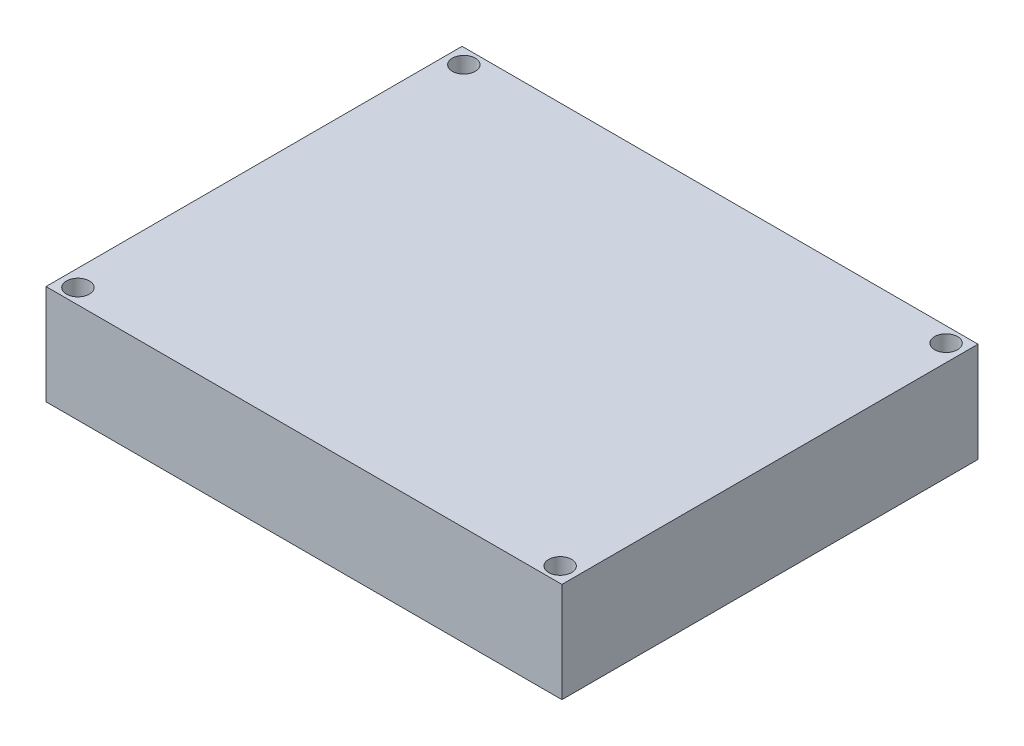
ISO-10303-21;
HEADER;
FILE_DESCRIPTION(('STEP AP214'),'2;1');
FILE_NAME('part.step','',(''),(''),'','','');
FILE_SCHEMA(('AUTOMOTIVE_DESIGN { 1 0 10303 214 1 1 1 1 }'));
ENDSEC;
DATA;
#1=APPLICATION_CONTEXT('core data for automotive mechanical design processes');
#2=APPLICATION_PROTOCOL_DEFINITION('international standard','automotive_design',2000,#1);
#3=PRODUCT_CONTEXT('',#1,'mechanical');
#4=PRODUCT('Part','Part','',(#3));
#5=PRODUCT_RELATED_PRODUCT_CATEGORY('part','',(#4));
#6=PRODUCT_DEFINITION_FORMATION('','',#4);
#7=PRODUCT_DEFINITION_CONTEXT('part definition',#1,'design');
#8=PRODUCT_DEFINITION('design','',#6,#7);
#9=PRODUCT_DEFINITION_SHAPE('','',#8);
#10=(LENGTH_UNIT() NAMED_UNIT(*) SI_UNIT(.MILLI.,.METRE.));
#11=(NAMED_UNIT(*) PLANE_ANGLE_UNIT() SI_UNIT($,.RADIAN.));
#12=(NAMED_UNIT(*) SI_UNIT($,.STERADIAN.) SOLID_ANGLE_UNIT());
#13=UNCERTAINTY_MEASURE_WITH_UNIT(LENGTH_MEASURE(1.E-05),#10,'distance_accuracy_value','');
#14=(GEOMETRIC_REPRESENTATION_CONTEXT(3) GLOBAL_UNCERTAINTY_ASSIGNED_CONTEXT((#13)) GLOBAL_UNIT_ASSIGNED_CONTEXT((#10,
#11,#12)) REPRESENTATION_CONTEXT('',''));
#15=CARTESIAN_POINT('',(0.,0.,0.));
#16=DIRECTION('',(0.,0.,1.));
#17=DIRECTION('',(1.,0.,0.));
#18=AXIS2_PLACEMENT_3D('',#15,#16,#17);
#19=CARTESIAN_POINT('',(0.,329.841390192382,0.));
#20=DIRECTION('',(0.,1.,0.));
#21=DIRECTION('',(0.,0.,1.));
#22=AXIS2_PLACEMENT_3D('',#19,#20,#21);
#23=PLANE('',#22);
#24=DIRECTION('',(0.,0.,1.));
#25=VECTOR('',#24,1.);
#26=CARTESIAN_POINT('',(-13.9910723176011,329.841390192382,-23.5500705078854));
#27=LINE('',#26,#25);
#28=CARTESIAN_POINT('',(-13.9910723176011,329.841390192382,-87.0500705078854));
#29=VERTEX_POINT('',#28);
#30=CARTESIAN_POINT('',(-13.9910723176011,329.841390192382,-23.5500705078854));
#31=VERTEX_POINT('',#30);
#32=EDGE_CURVE('E83',#29,#31,#27,.T.);
#33=ORIENTED_EDGE('',*,*,#32,.T.);
#34=DIRECTION('',(-1.,0.,0.));
#35=VECTOR('',#34,1.);
#36=CARTESIAN_POINT('',(-13.9910723176011,329.841390192382,-23.5500705078854));
#37=LINE('',#36,#35);
#38=CARTESIAN_POINT('',(-92.731072317601,329.841390192382,-23.5500705078854));
#39=VERTEX_POINT('',#38);
#40=EDGE_CURVE('E78',#31,#39,#37,.T.);
#41=ORIENTED_EDGE('',*,*,#40,.T.);
#42=DIRECTION('',(0.,0.,-1.));
#43=VECTOR('',#42,1.);
#44=CARTESIAN_POINT('',(-92.731072317601,329.841390192382,-23.5500705078854));
#45=LINE('',#44,#43);
#46=CARTESIAN_POINT('',(-92.7310723176011,329.841390192382,-87.0500705078854));
#47=VERTEX_POINT('',#46);
#48=EDGE_CURVE('E81',#39,#47,#45,.T.);
#49=ORIENTED_EDGE('',*,*,#48,.T.);
#50=DIRECTION('',(1.,0.,0.));
#51=VECTOR('',#50,1.);
#52=CARTESIAN_POINT('',(-13.9910723176011,329.841390192382,-87.0500705078854));
#53=LINE('',#52,#51);
#54=EDGE_CURVE('E48',#47,#29,#53,.T.);
#55=ORIENTED_EDGE('',*,*,#54,.T.);
#56=EDGE_LOOP('',(#33,#41,#49,#55));
#57=FACE_BOUND('',#56,.T.);
#58=CARTESIAN_POINT('',(-16.5610723176011,329.841390192382,-25.8500705078854));
#59=DIRECTION('',(0.,-1.,0.));
#60=DIRECTION('',(0.,0.,-1.));
#61=AXIS2_PLACEMENT_3D('',#58,#59,#60);
#62=CIRCLE('',#61,1.75000000000001);
#63=CARTESIAN_POINT('',(-16.5610723176011,329.841390192382,-24.1000705078854));
#64=VERTEX_POINT('',#63);
#65=EDGE_CURVE('E98',#64,#64,#62,.T.);
#66=ORIENTED_EDGE('',*,*,#65,.F.);
#67=EDGE_LOOP('',(#66));
#68=FACE_BOUND('',#67,.T.);
#69=CARTESIAN_POINT('',(-90.1610723176011,329.841390192382,-84.7500705078854));
#70=DIRECTION('',(0.,-1.,0.));
#71=DIRECTION('',(0.,0.,-1.));
#72=AXIS2_PLACEMENT_3D('',#69,#70,#71);
#73=CIRCLE('',#72,1.75000000000001);
#74=CARTESIAN_POINT('',(-90.1610723176011,329.841390192382,-83.0000705078854));
#75=VERTEX_POINT('',#74);
#76=EDGE_CURVE('E113',#75,#75,#73,.T.);
#77=ORIENTED_EDGE('',*,*,#76,.F.);
#78=EDGE_LOOP('',(#77));
#79=FACE_BOUND('',#78,.T.);
#80=CARTESIAN_POINT('',(-90.1610723176011,329.841390192382,-25.8500705078854));
#81=DIRECTION('',(0.,-1.,0.));
#82=DIRECTION('',(0.,0.,-1.));
#83=AXIS2_PLACEMENT_3D('',#80,#81,#82);
#84=CIRCLE('',#83,1.75000000000001);
#85=CARTESIAN_POINT('',(-90.1610723176011,329.841390192382,-24.1000705078854));
#86=VERTEX_POINT('',#85);
#87=EDGE_CURVE('E119',#86,#86,#84,.T.);
#88=ORIENTED_EDGE('',*,*,#87,.F.);
#89=EDGE_LOOP('',(#88));
#90=FACE_BOUND('',#89,.T.);
#91=CARTESIAN_POINT('',(-16.5610723176011,329.841390192382,-84.7500705078854));
#92=DIRECTION('',(0.,-1.,0.));
#93=DIRECTION('',(0.,0.,-1.));
#94=AXIS2_PLACEMENT_3D('',#91,#92,#93);
#95=CIRCLE('',#94,1.75000000000001);
#96=CARTESIAN_POINT('',(-16.5610723176011,329.841390192382,-83.0000705078854));
#97=VERTEX_POINT('',#96);
#98=EDGE_CURVE('E125',#97,#97,#95,.T.);
#99=ORIENTED_EDGE('',*,*,#98,.F.);
#100=EDGE_LOOP('',(#99));
#101=FACE_BOUND('',#100,.T.);
#102=ADVANCED_FACE('F31',(#57,#68,#79,#90,#101),#23,.F.);
#103=CARTESIAN_POINT('',(0.,345.081390192382,0.));
#104=DIRECTION('',(0.,1.,0.));
#105=DIRECTION('',(0.,0.,1.));
#106=AXIS2_PLACEMENT_3D('',#103,#104,#105);
#107=PLANE('',#106);
#108=CARTESIAN_POINT('',(-90.1610723176011,345.081390192382,-25.8500705078854));
#109=DIRECTION('',(0.,-1.,0.));
#110=DIRECTION('',(0.,0.,-1.));
#111=AXIS2_PLACEMENT_3D('',#108,#109,#110);
#112=CIRCLE('',#111,1.75000000000001);
#113=CARTESIAN_POINT('',(-90.1610723176011,345.081390192382,-24.1000705078854));
#114=VERTEX_POINT('',#113);
#115=EDGE_CURVE('E122',#114,#114,#112,.T.);
#116=ORIENTED_EDGE('',*,*,#115,.T.);
#117=EDGE_LOOP('',(#116));
#118=FACE_BOUND('',#117,.T.);
#119=CARTESIAN_POINT('',(-16.5610723176011,345.081390192382,-25.8500705078854));
#120=DIRECTION('',(0.,-1.,0.));
#121=DIRECTION('',(0.,0.,-1.));
#122=AXIS2_PLACEMENT_3D('',#119,#120,#121);
#123=CIRCLE('',#122,1.75000000000001);
#124=CARTESIAN_POINT('',(-16.5610723176011,345.081390192382,-24.1000705078854));
#125=VERTEX_POINT('',#124);
#126=EDGE_CURVE('E110',#125,#125,#123,.T.);
#127=ORIENTED_EDGE('',*,*,#126,.T.);
#128=EDGE_LOOP('',(#127));
#129=FACE_BOUND('',#128,.T.);
#130=DIRECTION('',(0.,0.,1.));
#131=VECTOR('',#130,1.);
#132=CARTESIAN_POINT('',(-13.9910723176011,345.081390192382,-23.5500705078854));
#133=LINE('',#132,#131);
#134=CARTESIAN_POINT('',(-13.9910723176011,345.081390192382,-87.0500705078854));
#135=VERTEX_POINT('',#134);
#136=CARTESIAN_POINT('',(-13.9910723176011,345.081390192382,-23.5500705078854));
#137=VERTEX_POINT('',#136);
#138=EDGE_CURVE('E95',#135,#137,#133,.T.);
#139=ORIENTED_EDGE('',*,*,#138,.F.);
#140=DIRECTION('',(1.,0.,0.));
#141=VECTOR('',#140,1.);
#142=CARTESIAN_POINT('',(-13.9910723176011,345.081390192382,-87.0500705078854));
#143=LINE('',#142,#141);
#144=CARTESIAN_POINT('',(-92.7310723176011,345.081390192382,-87.0500705078854));
#145=VERTEX_POINT('',#144);
#146=EDGE_CURVE('E71',#145,#135,#143,.T.);
#147=ORIENTED_EDGE('',*,*,#146,.F.);
#148=DIRECTION('',(0.,0.,-1.));
#149=VECTOR('',#148,1.);
#150=CARTESIAN_POINT('',(-92.731072317601,345.081390192382,-23.5500705078854));
#151=LINE('',#150,#149);
#152=CARTESIAN_POINT('',(-92.731072317601,345.081390192382,-23.5500705078854));
#153=VERTEX_POINT('',#152);
#154=EDGE_CURVE('E65',#153,#145,#151,.T.);
#155=ORIENTED_EDGE('',*,*,#154,.F.);
#156=DIRECTION('',(-1.,0.,0.));
#157=VECTOR('',#156,1.);
#158=CARTESIAN_POINT('',(-13.9910723176011,345.081390192382,-23.5500705078854));
#159=LINE('',#158,#157);
#160=EDGE_CURVE('E87',#137,#153,#159,.T.);
#161=ORIENTED_EDGE('',*,*,#160,.F.);
#162=EDGE_LOOP('',(#139,#147,#155,#161));
#163=FACE_BOUND('',#162,.T.);
#164=CARTESIAN_POINT('',(-90.1610723176011,345.081390192382,-84.7500705078854));
#165=DIRECTION('',(0.,-1.,0.));
#166=DIRECTION('',(0.,0.,-1.));
#167=AXIS2_PLACEMENT_3D('',#164,#165,#166);
#168=CIRCLE('',#167,1.75000000000001);
#169=CARTESIAN_POINT('',(-90.1610723176011,345.081390192382,-83.0000705078854));
#170=VERTEX_POINT('',#169);
#171=EDGE_CURVE('E116',#170,#170,#168,.T.);
#172=ORIENTED_EDGE('',*,*,#171,.T.);
#173=EDGE_LOOP('',(#172));
#174=FACE_BOUND('',#173,.T.);
#175=CARTESIAN_POINT('',(-16.5610723176011,345.081390192382,-84.7500705078854));
#176=DIRECTION('',(0.,-1.,0.));
#177=DIRECTION('',(0.,0.,-1.));
#178=AXIS2_PLACEMENT_3D('',#175,#176,#177);
#179=CIRCLE('',#178,1.75000000000001);
#180=CARTESIAN_POINT('',(-16.5610723176011,345.081390192382,-83.0000705078854));
#181=VERTEX_POINT('',#180);
#182=EDGE_CURVE('E128',#181,#181,#179,.T.);
#183=ORIENTED_EDGE('',*,*,#182,.T.);
#184=EDGE_LOOP('',(#183));
#185=FACE_BOUND('',#184,.T.);
#186=ADVANCED_FACE('F106',(#118,#129,#163,#174,#185),#107,.T.);
#187=CARTESIAN_POINT('',(-13.9910723176011,329.841390192382,-23.5500705078854));
#188=DIRECTION('',(-1.,0.,0.));
#189=DIRECTION('',(0.,0.,1.));
#190=AXIS2_PLACEMENT_3D('',#187,#188,#189);
#191=PLANE('',#190);
#192=ORIENTED_EDGE('',*,*,#138,.T.);
#193=DIRECTION('',(0.,1.,0.));
#194=VECTOR('',#193,1.);
#195=CARTESIAN_POINT('',(-13.9910723176011,329.841390192382,-23.5500705078854));
#196=LINE('',#195,#194);
#197=EDGE_CURVE('E11',#31,#137,#196,.T.);
#198=ORIENTED_EDGE('',*,*,#197,.F.);
#199=ORIENTED_EDGE('',*,*,#32,.F.);
#200=DIRECTION('',(0.,1.,0.));
#201=VECTOR('',#200,1.);
#202=CARTESIAN_POINT('',(-13.9910723176011,329.841390192382,-87.0500705078854));
#203=LINE('',#202,#201);
#204=EDGE_CURVE('E91',#29,#135,#203,.T.);
#205=ORIENTED_EDGE('',*,*,#204,.T.);
#206=EDGE_LOOP('',(#192,#198,#199,#205));
#207=FACE_BOUND('',#206,.T.);
#208=ADVANCED_FACE('F33',(#207),#191,.F.);
#209=CARTESIAN_POINT('',(-13.9910723176011,329.841390192382,-23.5500705078854));
#210=DIRECTION('',(0.,0.,-1.));
#211=DIRECTION('',(-1.,0.,0.));
#212=AXIS2_PLACEMENT_3D('',#209,#210,#211);
#213=PLANE('',#212);
#214=ORIENTED_EDGE('',*,*,#160,.T.);
#215=DIRECTION('',(0.,1.,0.));
#216=VECTOR('',#215,1.);
#217=CARTESIAN_POINT('',(-92.731072317601,329.841390192382,-23.5500705078854));
#218=LINE('',#217,#216);
#219=EDGE_CURVE('E40',#39,#153,#218,.T.);
#220=ORIENTED_EDGE('',*,*,#219,.F.);
#221=ORIENTED_EDGE('',*,*,#40,.F.);
#222=ORIENTED_EDGE('',*,*,#197,.T.);
#223=EDGE_LOOP('',(#214,#220,#221,#222));
#224=FACE_BOUND('',#223,.T.);
#225=ADVANCED_FACE('F86',(#224),#213,.F.);
#226=CARTESIAN_POINT('',(-92.731072317601,329.841390192382,-23.5500705078854));
#227=DIRECTION('',(1.,0.,0.));
#228=DIRECTION('',(0.,0.,-1.));
#229=AXIS2_PLACEMENT_3D('',#226,#227,#228);
#230=PLANE('',#229);
#231=ORIENTED_EDGE('',*,*,#154,.T.);
#232=DIRECTION('',(0.,1.,0.));
#233=VECTOR('',#232,1.);
#234=CARTESIAN_POINT('',(-92.7310723176011,329.841390192382,-87.0500705078854));
#235=LINE('',#234,#233);
#236=EDGE_CURVE('E88',#47,#145,#235,.T.);
#237=ORIENTED_EDGE('',*,*,#236,.F.);
#238=ORIENTED_EDGE('',*,*,#48,.F.);
#239=ORIENTED_EDGE('',*,*,#219,.T.);
#240=EDGE_LOOP('',(#231,#237,#238,#239));
#241=FACE_BOUND('',#240,.T.);
#242=ADVANCED_FACE('F89',(#241),#230,.F.);
#243=CARTESIAN_POINT('',(-13.9910723176011,329.841390192382,-87.0500705078854));
#244=DIRECTION('',(0.,0.,1.));
#245=DIRECTION('',(1.,0.,0.));
#246=AXIS2_PLACEMENT_3D('',#243,#244,#245);
#247=PLANE('',#246);
#248=ORIENTED_EDGE('',*,*,#146,.T.);
#249=ORIENTED_EDGE('',*,*,#204,.F.);
#250=ORIENTED_EDGE('',*,*,#54,.F.);
#251=ORIENTED_EDGE('',*,*,#236,.T.);
#252=EDGE_LOOP('',(#248,#249,#250,#251));
#253=FACE_BOUND('',#252,.T.);
#254=ADVANCED_FACE('F103',(#253),#247,.F.);
#255=CARTESIAN_POINT('',(-16.5610723176011,329.841390192382,-25.8500705078854));
#256=DIRECTION('',(0.,1.,0.));
#257=DIRECTION('',(0.,0.,1.));
#258=AXIS2_PLACEMENT_3D('',#255,#256,#257);
#259=CYLINDRICAL_SURFACE('',#258,1.75000000000001);
#260=CARTESIAN_POINT('',(-16.5610723176011,329.841390192382,-24.1000705078854));
#261=CARTESIAN_POINT('',(-16.5610723176011,330.000140192382,-24.1000705078854));
#262=CARTESIAN_POINT('',(-16.5610723176011,330.158890192382,-24.1000705078854));
#263=CARTESIAN_POINT('',(-16.5610723176011,330.476390192382,-24.1000705078854));
#264=CARTESIAN_POINT('',(-16.5610723176011,330.635140192382,-24.1000705078854));
#265=CARTESIAN_POINT('',(-16.5610723176011,330.952640192382,-24.1000705078854));
#266=CARTESIAN_POINT('',(-16.5610723176011,331.111390192382,-24.1000705078854));
#267=CARTESIAN_POINT('',(-16.5610723176011,331.428890192382,-24.1000705078854));
#268=CARTESIAN_POINT('',(-16.5610723176011,331.587640192382,-24.1000705078854));
#269=CARTESIAN_POINT('',(-16.5610723176011,331.905140192382,-24.1000705078854));
#270=CARTESIAN_POINT('',(-16.5610723176011,332.063890192382,-24.1000705078854));
#271=CARTESIAN_POINT('',(-16.5610723176011,332.381390192382,-24.1000705078854));
#272=CARTESIAN_POINT('',(-16.5610723176011,332.540140192382,-24.1000705078854));
#273=CARTESIAN_POINT('',(-16.5610723176011,332.857640192382,-24.1000705078854));
#274=CARTESIAN_POINT('',(-16.5610723176011,333.016390192382,-24.1000705078854));
#275=CARTESIAN_POINT('',(-16.5610723176011,333.333890192382,-24.1000705078854));
#276=CARTESIAN_POINT('',(-16.5610723176011,333.492640192382,-24.1000705078854));
#277=CARTESIAN_POINT('',(-16.5610723176011,333.810140192382,-24.1000705078854));
#278=CARTESIAN_POINT('',(-16.5610723176011,333.968890192382,-24.1000705078854));
#279=CARTESIAN_POINT('',(-16.5610723176011,334.286390192382,-24.1000705078854));
#280=CARTESIAN_POINT('',(-16.5610723176011,334.445140192382,-24.1000705078854));
#281=CARTESIAN_POINT('',(-16.5610723176011,334.762640192382,-24.1000705078854));
#282=CARTESIAN_POINT('',(-16.5610723176011,334.921390192382,-24.1000705078854));
#283=CARTESIAN_POINT('',(-16.5610723176011,335.238890192382,-24.1000705078854));
#284=CARTESIAN_POINT('',(-16.5610723176011,335.397640192382,-24.1000705078854));
#285=CARTESIAN_POINT('',(-16.5610723176011,335.715140192382,-24.1000705078854));
#286=CARTESIAN_POINT('',(-16.5610723176011,335.873890192382,-24.1000705078854));
#287=CARTESIAN_POINT('',(-16.5610723176011,336.191390192382,-24.1000705078854));
#288=CARTESIAN_POINT('',(-16.5610723176011,336.350140192382,-24.1000705078854));
#289=CARTESIAN_POINT('',(-16.5610723176011,336.667640192382,-24.1000705078854));
#290=CARTESIAN_POINT('',(-16.5610723176011,336.826390192382,-24.1000705078854));
#291=CARTESIAN_POINT('',(-16.5610723176011,337.143890192382,-24.1000705078854));
#292=CARTESIAN_POINT('',(-16.5610723176011,337.302640192382,-24.1000705078854));
#293=CARTESIAN_POINT('',(-16.5610723176011,337.620140192382,-24.1000705078854));
#294=CARTESIAN_POINT('',(-16.5610723176011,337.778890192382,-24.1000705078854));
#295=CARTESIAN_POINT('',(-16.5610723176011,338.096390192382,-24.1000705078854));
#296=CARTESIAN_POINT('',(-16.5610723176011,338.255140192382,-24.1000705078854));
#297=CARTESIAN_POINT('',(-16.5610723176011,338.572640192382,-24.1000705078854));
#298=CARTESIAN_POINT('',(-16.5610723176011,338.731390192382,-24.1000705078854));
#299=CARTESIAN_POINT('',(-16.5610723176011,339.048890192382,-24.1000705078854));
#300=CARTESIAN_POINT('',(-16.5610723176011,339.207640192382,-24.1000705078854));
#301=CARTESIAN_POINT('',(-16.5610723176011,339.525140192382,-24.1000705078854));
#302=CARTESIAN_POINT('',(-16.5610723176011,339.683890192382,-24.1000705078854));
#303=CARTESIAN_POINT('',(-16.5610723176011,340.001390192382,-24.1000705078854));
#304=CARTESIAN_POINT('',(-16.5610723176011,340.160140192382,-24.1000705078854));
#305=CARTESIAN_POINT('',(-16.5610723176011,340.477640192382,-24.1000705078854));
#306=CARTESIAN_POINT('',(-16.5610723176011,340.636390192382,-24.1000705078854));
#307=CARTESIAN_POINT('',(-16.5610723176011,340.953890192382,-24.1000705078854));
#308=CARTESIAN_POINT('',(-16.5610723176011,341.112640192382,-24.1000705078854));
#309=CARTESIAN_POINT('',(-16.5610723176011,341.430140192382,-24.1000705078854));
#310=CARTESIAN_POINT('',(-16.5610723176011,341.588890192382,-24.1000705078854));
#311=CARTESIAN_POINT('',(-16.5610723176011,341.906390192382,-24.1000705078854));
#312=CARTESIAN_POINT('',(-16.5610723176011,342.065140192382,-24.1000705078854));
#313=CARTESIAN_POINT('',(-16.5610723176011,342.382640192382,-24.1000705078854));
#314=CARTESIAN_POINT('',(-16.5610723176011,342.541390192382,-24.1000705078854));
#315=CARTESIAN_POINT('',(-16.5610723176011,342.858890192382,-24.1000705078854));
#316=CARTESIAN_POINT('',(-16.5610723176011,343.017640192382,-24.1000705078854));
#317=CARTESIAN_POINT('',(-16.5610723176011,343.335140192382,-24.1000705078854));
#318=CARTESIAN_POINT('',(-16.5610723176011,343.493890192382,-24.1000705078854));
#319=CARTESIAN_POINT('',(-16.5610723176011,343.811390192382,-24.1000705078854));
#320=CARTESIAN_POINT('',(-16.5610723176011,343.970140192382,-24.1000705078854));
#321=CARTESIAN_POINT('',(-16.5610723176011,344.287640192382,-24.1000705078854));
#322=CARTESIAN_POINT('',(-16.5610723176011,344.446390192382,-24.1000705078854));
#323=CARTESIAN_POINT('',(-16.5610723176011,344.763890192382,-24.1000705078854));
#324=CARTESIAN_POINT('',(-16.5610723176011,344.922640192382,-24.1000705078854));
#325=CARTESIAN_POINT('',(-16.5610723176011,345.081390192382,-24.1000705078854));
#326=B_SPLINE_CURVE_WITH_KNOTS('',3,(#260,#261,#262,#263,#264,#265,#266,#267,#268,#269,#270,
#271,#272,#273,#274,#275,#276,#277,#278,#279,#280,#281,#282,#283,#284,#285,#286,#287,#288,#289,
#290,#291,#292,#293,#294,#295,#296,#297,#298,#299,#300,#301,#302,#303,#304,#305,#306,#307,#308,
#309,#310,#311,#312,#313,#314,#315,#316,#317,#318,#319,#320,#321,#322,#323,#324,#325),
.UNSPECIFIED.,.F.,.F.,(4,2,2,2,2,2,2,2,2,2,2,2,2,2,2,2,2,2,2,2,2,2,2,2,2,2,2,2,2,2,2,2,4),(0.,
0.476249999999956,0.952499999999967,1.42874999999998,1.90499999999999,2.38124999999995,
2.85749999999996,3.33374999999997,3.80999999999998,4.28624999999999,4.76249999999995,
5.23874999999996,5.71499999999997,6.19124999999998,6.66749999999994,7.14374999999995,
7.61999999999996,8.09624999999997,8.57249999999998,9.04874999999994,9.52499999999995,10.00125,
10.4775,10.9537499999999,11.4299999999999,11.90625,12.3825,12.85875,13.3349999999999,
13.8112499999999,14.2875,14.76375,15.24),.UNSPECIFIED.);
#327=EDGE_CURVE('BSEAM145',#64,#125,#326,.T.);
#328=ORIENTED_EDGE('',*,*,#65,.T.);
#329=ORIENTED_EDGE('',*,*,#126,.F.);
#330=ORIENTED_EDGE('',*,*,#327,.T.);
#331=ORIENTED_EDGE('',*,*,#327,.F.);
#332=EDGE_LOOP('',(#328,#330,#329,#331));
#333=FACE_BOUND('',#332,.T.);
#334=ADVANCED_FACE('F145',(#333),#259,.F.);
#335=CARTESIAN_POINT('',(-90.1610723176011,329.841390192382,-84.7500705078854));
#336=DIRECTION('',(0.,1.,0.));
#337=DIRECTION('',(0.,0.,1.));
#338=AXIS2_PLACEMENT_3D('',#335,#336,#337);
#339=CYLINDRICAL_SURFACE('',#338,1.75000000000001);
#340=CARTESIAN_POINT('',(-90.1610723176011,329.841390192382,-83.0000705078854));
#341=CARTESIAN_POINT('',(-90.1610723176011,330.000140192382,-83.0000705078854));
#342=CARTESIAN_POINT('',(-90.1610723176011,330.158890192382,-83.0000705078854));
#343=CARTESIAN_POINT('',(-90.1610723176011,330.476390192382,-83.0000705078854));
#344=CARTESIAN_POINT('',(-90.1610723176011,330.635140192382,-83.0000705078854));
#345=CARTESIAN_POINT('',(-90.1610723176011,330.952640192382,-83.0000705078854));
#346=CARTESIAN_POINT('',(-90.1610723176011,331.111390192382,-83.0000705078854));
#347=CARTESIAN_POINT('',(-90.1610723176011,331.428890192382,-83.0000705078854));
#348=CARTESIAN_POINT('',(-90.1610723176011,331.587640192382,-83.0000705078854));
#349=CARTESIAN_POINT('',(-90.1610723176011,331.905140192382,-83.0000705078854));
#350=CARTESIAN_POINT('',(-90.1610723176011,332.063890192382,-83.0000705078854));
#351=CARTESIAN_POINT('',(-90.1610723176011,332.381390192382,-83.0000705078854));
#352=CARTESIAN_POINT('',(-90.1610723176011,332.540140192382,-83.0000705078854));
#353=CARTESIAN_POINT('',(-90.1610723176011,332.857640192382,-83.0000705078854));
#354=CARTESIAN_POINT('',(-90.1610723176011,333.016390192382,-83.0000705078854));
#355=CARTESIAN_POINT('',(-90.1610723176011,333.333890192382,-83.0000705078854));
#356=CARTESIAN_POINT('',(-90.1610723176011,333.492640192382,-83.0000705078854));
#357=CARTESIAN_POINT('',(-90.1610723176011,333.810140192382,-83.0000705078854));
#358=CARTESIAN_POINT('',(-90.1610723176011,333.968890192382,-83.0000705078854));
#359=CARTESIAN_POINT('',(-90.1610723176011,334.286390192382,-83.0000705078854));
#360=CARTESIAN_POINT('',(-90.1610723176011,334.445140192382,-83.0000705078854));
#361=CARTESIAN_POINT('',(-90.1610723176011,334.762640192382,-83.0000705078854));
#362=CARTESIAN_POINT('',(-90.1610723176011,334.921390192382,-83.0000705078854));
#363=CARTESIAN_POINT('',(-90.1610723176011,335.238890192382,-83.0000705078854));
#364=CARTESIAN_POINT('',(-90.1610723176011,335.397640192382,-83.0000705078854));
#365=CARTESIAN_POINT('',(-90.1610723176011,335.715140192382,-83.0000705078854));
#366=CARTESIAN_POINT('',(-90.1610723176011,335.873890192382,-83.0000705078854));
#367=CARTESIAN_POINT('',(-90.1610723176011,336.191390192382,-83.0000705078854));
#368=CARTESIAN_POINT('',(-90.1610723176011,336.350140192382,-83.0000705078854));
#369=CARTESIAN_POINT('',(-90.1610723176011,336.667640192382,-83.0000705078854));
#370=CARTESIAN_POINT('',(-90.1610723176011,336.826390192382,-83.0000705078854));
#371=CARTESIAN_POINT('',(-90.1610723176011,337.143890192382,-83.0000705078854));
#372=CARTESIAN_POINT('',(-90.1610723176011,337.302640192382,-83.0000705078854));
#373=CARTESIAN_POINT('',(-90.1610723176011,337.620140192382,-83.0000705078854));
#374=CARTESIAN_POINT('',(-90.1610723176011,337.778890192382,-83.0000705078854));
#375=CARTESIAN_POINT('',(-90.1610723176011,338.096390192382,-83.0000705078854));
#376=CARTESIAN_POINT('',(-90.1610723176011,338.255140192382,-83.0000705078854));
#377=CARTESIAN_POINT('',(-90.1610723176011,338.572640192382,-83.0000705078854));
#378=CARTESIAN_POINT('',(-90.1610723176011,338.731390192382,-83.0000705078854));
#379=CARTESIAN_POINT('',(-90.1610723176011,339.048890192382,-83.0000705078854));
#380=CARTESIAN_POINT('',(-90.1610723176011,339.207640192382,-83.0000705078854));
#381=CARTESIAN_POINT('',(-90.1610723176011,339.525140192382,-83.0000705078854));
#382=CARTESIAN_POINT('',(-90.1610723176011,339.683890192382,-83.0000705078854));
#383=CARTESIAN_POINT('',(-90.1610723176011,340.001390192382,-83.0000705078854));
#384=CARTESIAN_POINT('',(-90.1610723176011,340.160140192382,-83.0000705078854));
#385=CARTESIAN_POINT('',(-90.1610723176011,340.477640192382,-83.0000705078854));
#386=CARTESIAN_POINT('',(-90.1610723176011,340.636390192382,-83.0000705078854));
#387=CARTESIAN_POINT('',(-90.1610723176011,340.953890192382,-83.0000705078854));
#388=CARTESIAN_POINT('',(-90.1610723176011,341.112640192382,-83.0000705078854));
#389=CARTESIAN_POINT('',(-90.1610723176011,341.430140192382,-83.0000705078854));
#390=CARTESIAN_POINT('',(-90.1610723176011,341.588890192382,-83.0000705078854));
#391=CARTESIAN_POINT('',(-90.1610723176011,341.906390192382,-83.0000705078854));
#392=CARTESIAN_POINT('',(-90.1610723176011,342.065140192382,-83.0000705078854));
#393=CARTESIAN_POINT('',(-90.1610723176011,342.382640192382,-83.0000705078854));
#394=CARTESIAN_POINT('',(-90.1610723176011,342.541390192382,-83.0000705078854));
#395=CARTESIAN_POINT('',(-90.1610723176011,342.858890192382,-83.0000705078854));
#396=CARTESIAN_POINT('',(-90.1610723176011,343.017640192382,-83.0000705078854));
#397=CARTESIAN_POINT('',(-90.1610723176011,343.335140192382,-83.0000705078854));
#398=CARTESIAN_POINT('',(-90.1610723176011,343.493890192382,-83.0000705078854));
#399=CARTESIAN_POINT('',(-90.1610723176011,343.811390192382,-83.0000705078854));
#400=CARTESIAN_POINT('',(-90.1610723176011,343.970140192382,-83.0000705078854));
#401=CARTESIAN_POINT('',(-90.1610723176011,344.287640192382,-83.0000705078854));
#402=CARTESIAN_POINT('',(-90.1610723176011,344.446390192382,-83.0000705078854));
#403=CARTESIAN_POINT('',(-90.1610723176011,344.763890192382,-83.0000705078854));
#404=CARTESIAN_POINT('',(-90.1610723176011,344.922640192382,-83.0000705078854));
#405=CARTESIAN_POINT('',(-90.1610723176011,345.081390192382,-83.0000705078854));
#406=B_SPLINE_CURVE_WITH_KNOTS('',3,(#340,#341,#342,#343,#344,#345,#346,#347,#348,#349,#350,
#351,#352,#353,#354,#355,#356,#357,#358,#359,#360,#361,#362,#363,#364,#365,#366,#367,#368,#369,
#370,#371,#372,#373,#374,#375,#376,#377,#378,#379,#380,#381,#382,#383,#384,#385,#386,#387,#388,
#389,#390,#391,#392,#393,#394,#395,#396,#397,#398,#399,#400,#401,#402,#403,#404,#405),
.UNSPECIFIED.,.F.,.F.,(4,2,2,2,2,2,2,2,2,2,2,2,2,2,2,2,2,2,2,2,2,2,2,2,2,2,2,2,2,2,2,2,4),(0.,
0.476249999999956,0.952499999999967,1.42874999999998,1.90499999999999,2.38124999999995,
2.85749999999996,3.33374999999997,3.80999999999998,4.28624999999999,4.76249999999995,
5.23874999999996,5.71499999999997,6.19124999999998,6.66749999999994,7.14374999999995,
7.61999999999996,8.09624999999997,8.57249999999998,9.04874999999994,9.52499999999995,10.00125,
10.4775,10.9537499999999,11.4299999999999,11.90625,12.3825,12.85875,13.3349999999999,
13.8112499999999,14.2875,14.76375,15.24),.UNSPECIFIED.);
#407=EDGE_CURVE('BSEAM191',#75,#170,#406,.T.);
#408=ORIENTED_EDGE('',*,*,#76,.T.);
#409=ORIENTED_EDGE('',*,*,#171,.F.);
#410=ORIENTED_EDGE('',*,*,#407,.T.);
#411=ORIENTED_EDGE('',*,*,#407,.F.);
#412=EDGE_LOOP('',(#408,#410,#409,#411));
#413=FACE_BOUND('',#412,.T.);
#414=ADVANCED_FACE('F191',(#413),#339,.F.);
#415=CARTESIAN_POINT('',(-90.1610723176011,329.841390192382,-25.8500705078854));
#416=DIRECTION('',(0.,1.,0.));
#417=DIRECTION('',(0.,0.,1.));
#418=AXIS2_PLACEMENT_3D('',#415,#416,#417);
#419=CYLINDRICAL_SURFACE('',#418,1.75000000000001);
#420=CARTESIAN_POINT('',(-90.1610723176011,329.841390192382,-24.1000705078854));
#421=CARTESIAN_POINT('',(-90.1610723176011,330.000140192382,-24.1000705078854));
#422=CARTESIAN_POINT('',(-90.1610723176011,330.158890192382,-24.1000705078854));
#423=CARTESIAN_POINT('',(-90.1610723176011,330.476390192382,-24.1000705078854));
#424=CARTESIAN_POINT('',(-90.1610723176011,330.635140192382,-24.1000705078854));
#425=CARTESIAN_POINT('',(-90.1610723176011,330.952640192382,-24.1000705078854));
#426=CARTESIAN_POINT('',(-90.1610723176011,331.111390192382,-24.1000705078854));
#427=CARTESIAN_POINT('',(-90.1610723176011,331.428890192382,-24.1000705078854));
#428=CARTESIAN_POINT('',(-90.1610723176011,331.587640192382,-24.1000705078854));
#429=CARTESIAN_POINT('',(-90.1610723176011,331.905140192382,-24.1000705078854));
#430=CARTESIAN_POINT('',(-90.1610723176011,332.063890192382,-24.1000705078854));
#431=CARTESIAN_POINT('',(-90.1610723176011,332.381390192382,-24.1000705078854));
#432=CARTESIAN_POINT('',(-90.1610723176011,332.540140192382,-24.1000705078854));
#433=CARTESIAN_POINT('',(-90.1610723176011,332.857640192382,-24.1000705078854));
#434=CARTESIAN_POINT('',(-90.1610723176011,333.016390192382,-24.1000705078854));
#435=CARTESIAN_POINT('',(-90.1610723176011,333.333890192382,-24.1000705078854));
#436=CARTESIAN_POINT('',(-90.1610723176011,333.492640192382,-24.1000705078854));
#437=CARTESIAN_POINT('',(-90.1610723176011,333.810140192382,-24.1000705078854));
#438=CARTESIAN_POINT('',(-90.1610723176011,333.968890192382,-24.1000705078854));
#439=CARTESIAN_POINT('',(-90.1610723176011,334.286390192382,-24.1000705078854));
#440=CARTESIAN_POINT('',(-90.1610723176011,334.445140192382,-24.1000705078854));
#441=CARTESIAN_POINT('',(-90.1610723176011,334.762640192382,-24.1000705078854));
#442=CARTESIAN_POINT('',(-90.1610723176011,334.921390192382,-24.1000705078854));
#443=CARTESIAN_POINT('',(-90.1610723176011,335.238890192382,-24.1000705078854));
#444=CARTESIAN_POINT('',(-90.1610723176011,335.397640192382,-24.1000705078854));
#445=CARTESIAN_POINT('',(-90.1610723176011,335.715140192382,-24.1000705078854));
#446=CARTESIAN_POINT('',(-90.1610723176011,335.873890192382,-24.1000705078854));
#447=CARTESIAN_POINT('',(-90.1610723176011,336.191390192382,-24.1000705078854));
#448=CARTESIAN_POINT('',(-90.1610723176011,336.350140192382,-24.1000705078854));
#449=CARTESIAN_POINT('',(-90.1610723176011,336.667640192382,-24.1000705078854));
#450=CARTESIAN_POINT('',(-90.1610723176011,336.826390192382,-24.1000705078854));
#451=CARTESIAN_POINT('',(-90.1610723176011,337.143890192382,-24.1000705078854));
#452=CARTESIAN_POINT('',(-90.1610723176011,337.302640192382,-24.1000705078854));
#453=CARTESIAN_POINT('',(-90.1610723176011,337.620140192382,-24.1000705078854));
#454=CARTESIAN_POINT('',(-90.1610723176011,337.778890192382,-24.1000705078854));
#455=CARTESIAN_POINT('',(-90.1610723176011,338.096390192382,-24.1000705078854));
#456=CARTESIAN_POINT('',(-90.1610723176011,338.255140192382,-24.1000705078854));
#457=CARTESIAN_POINT('',(-90.1610723176011,338.572640192382,-24.1000705078854));
#458=CARTESIAN_POINT('',(-90.1610723176011,338.731390192382,-24.1000705078854));
#459=CARTESIAN_POINT('',(-90.1610723176011,339.048890192382,-24.1000705078854));
#460=CARTESIAN_POINT('',(-90.1610723176011,339.207640192382,-24.1000705078854));
#461=CARTESIAN_POINT('',(-90.1610723176011,339.525140192382,-24.1000705078854));
#462=CARTESIAN_POINT('',(-90.1610723176011,339.683890192382,-24.1000705078854));
#463=CARTESIAN_POINT('',(-90.1610723176011,340.001390192382,-24.1000705078854));
#464=CARTESIAN_POINT('',(-90.1610723176011,340.160140192382,-24.1000705078854));
#465=CARTESIAN_POINT('',(-90.1610723176011,340.477640192382,-24.1000705078854));
#466=CARTESIAN_POINT('',(-90.1610723176011,340.636390192382,-24.1000705078854));
#467=CARTESIAN_POINT('',(-90.1610723176011,340.953890192382,-24.1000705078854));
#468=CARTESIAN_POINT('',(-90.1610723176011,341.112640192382,-24.1000705078854));
#469=CARTESIAN_POINT('',(-90.1610723176011,341.430140192382,-24.1000705078854));
#470=CARTESIAN_POINT('',(-90.1610723176011,341.588890192382,-24.1000705078854));
#471=CARTESIAN_POINT('',(-90.1610723176011,341.906390192382,-24.1000705078854));
#472=CARTESIAN_POINT('',(-90.1610723176011,342.065140192382,-24.1000705078854));
#473=CARTESIAN_POINT('',(-90.1610723176011,342.382640192382,-24.1000705078854));
#474=CARTESIAN_POINT('',(-90.1610723176011,342.541390192382,-24.1000705078854));
#475=CARTESIAN_POINT('',(-90.1610723176011,342.858890192382,-24.1000705078854));
#476=CARTESIAN_POINT('',(-90.1610723176011,343.017640192382,-24.1000705078854));
#477=CARTESIAN_POINT('',(-90.1610723176011,343.335140192382,-24.1000705078854));
#478=CARTESIAN_POINT('',(-90.1610723176011,343.493890192382,-24.1000705078854));
#479=CARTESIAN_POINT('',(-90.1610723176011,343.811390192382,-24.1000705078854));
#480=CARTESIAN_POINT('',(-90.1610723176011,343.970140192382,-24.1000705078854));
#481=CARTESIAN_POINT('',(-90.1610723176011,344.287640192382,-24.1000705078854));
#482=CARTESIAN_POINT('',(-90.1610723176011,344.446390192382,-24.1000705078854));
#483=CARTESIAN_POINT('',(-90.1610723176011,344.763890192382,-24.1000705078854));
#484=CARTESIAN_POINT('',(-90.1610723176011,344.922640192382,-24.1000705078854));
#485=CARTESIAN_POINT('',(-90.1610723176011,345.081390192382,-24.1000705078854));
#486=B_SPLINE_CURVE_WITH_KNOTS('',3,(#420,#421,#422,#423,#424,#425,#426,#427,#428,#429,#430,
#431,#432,#433,#434,#435,#436,#437,#438,#439,#440,#441,#442,#443,#444,#445,#446,#447,#448,#449,
#450,#451,#452,#453,#454,#455,#456,#457,#458,#459,#460,#461,#462,#463,#464,#465,#466,#467,#468,
#469,#470,#471,#472,#473,#474,#475,#476,#477,#478,#479,#480,#481,#482,#483,#484,#485),
.UNSPECIFIED.,.F.,.F.,(4,2,2,2,2,2,2,2,2,2,2,2,2,2,2,2,2,2,2,2,2,2,2,2,2,2,2,2,2,2,2,2,4),(0.,
0.476249999999956,0.952499999999967,1.42874999999998,1.90499999999999,2.38124999999995,
2.85749999999996,3.33374999999997,3.80999999999998,4.28624999999999,4.76249999999995,
5.23874999999996,5.71499999999997,6.19124999999998,6.66749999999994,7.14374999999995,
7.61999999999996,8.09624999999997,8.57249999999998,9.04874999999994,9.52499999999995,10.00125,
10.4775,10.9537499999999,11.4299999999999,11.90625,12.3825,12.85875,13.3349999999999,
13.8112499999999,14.2875,14.76375,15.24),.UNSPECIFIED.);
#487=EDGE_CURVE('BSEAM199',#86,#114,#486,.T.);
#488=ORIENTED_EDGE('',*,*,#87,.T.);
#489=ORIENTED_EDGE('',*,*,#115,.F.);
#490=ORIENTED_EDGE('',*,*,#487,.T.);
#491=ORIENTED_EDGE('',*,*,#487,.F.);
#492=EDGE_LOOP('',(#488,#490,#489,#491));
#493=FACE_BOUND('',#492,.T.);
#494=ADVANCED_FACE('F199',(#493),#419,.F.);
#495=CARTESIAN_POINT('',(-16.5610723176011,329.841390192382,-84.7500705078854));
#496=DIRECTION('',(0.,1.,0.));
#497=DIRECTION('',(0.,0.,1.));
#498=AXIS2_PLACEMENT_3D('',#495,#496,#497);
#499=CYLINDRICAL_SURFACE('',#498,1.75000000000001);
#500=CARTESIAN_POINT('',(-16.5610723176011,329.841390192382,-83.0000705078854));
#501=CARTESIAN_POINT('',(-16.5610723176011,330.000140192382,-83.0000705078854));
#502=CARTESIAN_POINT('',(-16.5610723176011,330.158890192382,-83.0000705078854));
#503=CARTESIAN_POINT('',(-16.5610723176011,330.476390192382,-83.0000705078854));
#504=CARTESIAN_POINT('',(-16.5610723176011,330.635140192382,-83.0000705078854));
#505=CARTESIAN_POINT('',(-16.5610723176011,330.952640192382,-83.0000705078854));
#506=CARTESIAN_POINT('',(-16.5610723176011,331.111390192382,-83.0000705078854));
#507=CARTESIAN_POINT('',(-16.5610723176011,331.428890192382,-83.0000705078854));
#508=CARTESIAN_POINT('',(-16.5610723176011,331.587640192382,-83.0000705078854));
#509=CARTESIAN_POINT('',(-16.5610723176011,331.905140192382,-83.0000705078854));
#510=CARTESIAN_POINT('',(-16.5610723176011,332.063890192382,-83.0000705078854));
#511=CARTESIAN_POINT('',(-16.5610723176011,332.381390192382,-83.0000705078854));
#512=CARTESIAN_POINT('',(-16.5610723176011,332.540140192382,-83.0000705078854));
#513=CARTESIAN_POINT('',(-16.5610723176011,332.857640192382,-83.0000705078854));
#514=CARTESIAN_POINT('',(-16.5610723176011,333.016390192382,-83.0000705078854));
#515=CARTESIAN_POINT('',(-16.5610723176011,333.333890192382,-83.0000705078854));
#516=CARTESIAN_POINT('',(-16.5610723176011,333.492640192382,-83.0000705078854));
#517=CARTESIAN_POINT('',(-16.5610723176011,333.810140192382,-83.0000705078854));
#518=CARTESIAN_POINT('',(-16.5610723176011,333.968890192382,-83.0000705078854));
#519=CARTESIAN_POINT('',(-16.5610723176011,334.286390192382,-83.0000705078854));
#520=CARTESIAN_POINT('',(-16.5610723176011,334.445140192382,-83.0000705078854));
#521=CARTESIAN_POINT('',(-16.5610723176011,334.762640192382,-83.0000705078854));
#522=CARTESIAN_POINT('',(-16.5610723176011,334.921390192382,-83.0000705078854));
#523=CARTESIAN_POINT('',(-16.5610723176011,335.238890192382,-83.0000705078854));
#524=CARTESIAN_POINT('',(-16.5610723176011,335.397640192382,-83.0000705078854));
#525=CARTESIAN_POINT('',(-16.5610723176011,335.715140192382,-83.0000705078854));
#526=CARTESIAN_POINT('',(-16.5610723176011,335.873890192382,-83.0000705078854));
#527=CARTESIAN_POINT('',(-16.5610723176011,336.191390192382,-83.0000705078854));
#528=CARTESIAN_POINT('',(-16.5610723176011,336.350140192382,-83.0000705078854));
#529=CARTESIAN_POINT('',(-16.5610723176011,336.667640192382,-83.0000705078854));
#530=CARTESIAN_POINT('',(-16.5610723176011,336.826390192382,-83.0000705078854));
#531=CARTESIAN_POINT('',(-16.5610723176011,337.143890192382,-83.0000705078854));
#532=CARTESIAN_POINT('',(-16.5610723176011,337.302640192382,-83.0000705078854));
#533=CARTESIAN_POINT('',(-16.5610723176011,337.620140192382,-83.0000705078854));
#534=CARTESIAN_POINT('',(-16.5610723176011,337.778890192382,-83.0000705078854));
#535=CARTESIAN_POINT('',(-16.5610723176011,338.096390192382,-83.0000705078854));
#536=CARTESIAN_POINT('',(-16.5610723176011,338.255140192382,-83.0000705078854));
#537=CARTESIAN_POINT('',(-16.5610723176011,338.572640192382,-83.0000705078854));
#538=CARTESIAN_POINT('',(-16.5610723176011,338.731390192382,-83.0000705078854));
#539=CARTESIAN_POINT('',(-16.5610723176011,339.048890192382,-83.0000705078854));
#540=CARTESIAN_POINT('',(-16.5610723176011,339.207640192382,-83.0000705078854));
#541=CARTESIAN_POINT('',(-16.5610723176011,339.525140192382,-83.0000705078854));
#542=CARTESIAN_POINT('',(-16.5610723176011,339.683890192382,-83.0000705078854));
#543=CARTESIAN_POINT('',(-16.5610723176011,340.001390192382,-83.0000705078854));
#544=CARTESIAN_POINT('',(-16.5610723176011,340.160140192382,-83.0000705078854));
#545=CARTESIAN_POINT('',(-16.5610723176011,340.477640192382,-83.0000705078854));
#546=CARTESIAN_POINT('',(-16.5610723176011,340.636390192382,-83.0000705078854));
#547=CARTESIAN_POINT('',(-16.5610723176011,340.953890192382,-83.0000705078854));
#548=CARTESIAN_POINT('',(-16.5610723176011,341.112640192382,-83.0000705078854));
#549=CARTESIAN_POINT('',(-16.5610723176011,341.430140192382,-83.0000705078854));
#550=CARTESIAN_POINT('',(-16.5610723176011,341.588890192382,-83.0000705078854));
#551=CARTESIAN_POINT('',(-16.5610723176011,341.906390192382,-83.0000705078854));
#552=CARTESIAN_POINT('',(-16.5610723176011,342.065140192382,-83.0000705078854));
#553=CARTESIAN_POINT('',(-16.5610723176011,342.382640192382,-83.0000705078854));
#554=CARTESIAN_POINT('',(-16.5610723176011,342.541390192382,-83.0000705078854));
#555=CARTESIAN_POINT('',(-16.5610723176011,342.858890192382,-83.0000705078854));
#556=CARTESIAN_POINT('',(-16.5610723176011,343.017640192382,-83.0000705078854));
#557=CARTESIAN_POINT('',(-16.5610723176011,343.335140192382,-83.0000705078854));
#558=CARTESIAN_POINT('',(-16.5610723176011,343.493890192382,-83.0000705078854));
#559=CARTESIAN_POINT('',(-16.5610723176011,343.811390192382,-83.0000705078854));
#560=CARTESIAN_POINT('',(-16.5610723176011,343.970140192382,-83.0000705078854));
#561=CARTESIAN_POINT('',(-16.5610723176011,344.287640192382,-83.0000705078854));
#562=CARTESIAN_POINT('',(-16.5610723176011,344.446390192382,-83.0000705078854));
#563=CARTESIAN_POINT('',(-16.5610723176011,344.763890192382,-83.0000705078854));
#564=CARTESIAN_POINT('',(-16.5610723176011,344.922640192382,-83.0000705078854));
#565=CARTESIAN_POINT('',(-16.5610723176011,345.081390192382,-83.0000705078854));
#566=B_SPLINE_CURVE_WITH_KNOTS('',3,(#500,#501,#502,#503,#504,#505,#506,#507,#508,#509,#510,
#511,#512,#513,#514,#515,#516,#517,#518,#519,#520,#521,#522,#523,#524,#525,#526,#527,#528,#529,
#530,#531,#532,#533,#534,#535,#536,#537,#538,#539,#540,#541,#542,#543,#544,#545,#546,#547,#548,
#549,#550,#551,#552,#553,#554,#555,#556,#557,#558,#559,#560,#561,#562,#563,#564,#565),
.UNSPECIFIED.,.F.,.F.,(4,2,2,2,2,2,2,2,2,2,2,2,2,2,2,2,2,2,2,2,2,2,2,2,2,2,2,2,2,2,2,2,4),(0.,
0.476249999999956,0.952499999999967,1.42874999999998,1.90499999999999,2.38124999999995,
2.85749999999996,3.33374999999997,3.80999999999998,4.28624999999999,4.76249999999995,
5.23874999999996,5.71499999999997,6.19124999999998,6.66749999999994,7.14374999999995,
7.61999999999996,8.09624999999997,8.57249999999998,9.04874999999994,9.52499999999995,10.00125,
10.4775,10.9537499999999,11.4299999999999,11.90625,12.3825,12.85875,13.3349999999999,
13.8112499999999,14.2875,14.76375,15.24),.UNSPECIFIED.);
#567=EDGE_CURVE('BSEAM134',#97,#181,#566,.T.);
#568=ORIENTED_EDGE('',*,*,#98,.T.);
#569=ORIENTED_EDGE('',*,*,#182,.F.);
#570=ORIENTED_EDGE('',*,*,#567,.T.);
#571=ORIENTED_EDGE('',*,*,#567,.F.);
#572=EDGE_LOOP('',(#568,#570,#569,#571));
#573=FACE_BOUND('',#572,.T.);
#574=ADVANCED_FACE('F134',(#573),#499,.F.);
#575=CLOSED_SHELL('',(#102,#186,#208,#225,#242,#254,#334,#414,#494,#574));
#576=MANIFOLD_SOLID_BREP('B2',#575);
#577=ADVANCED_BREP_SHAPE_REPRESENTATION('',(#18,#576),#14);
#578=SHAPE_DEFINITION_REPRESENTATION(#9,#577);
ENDSEC;
END-ISO-10303-21;
